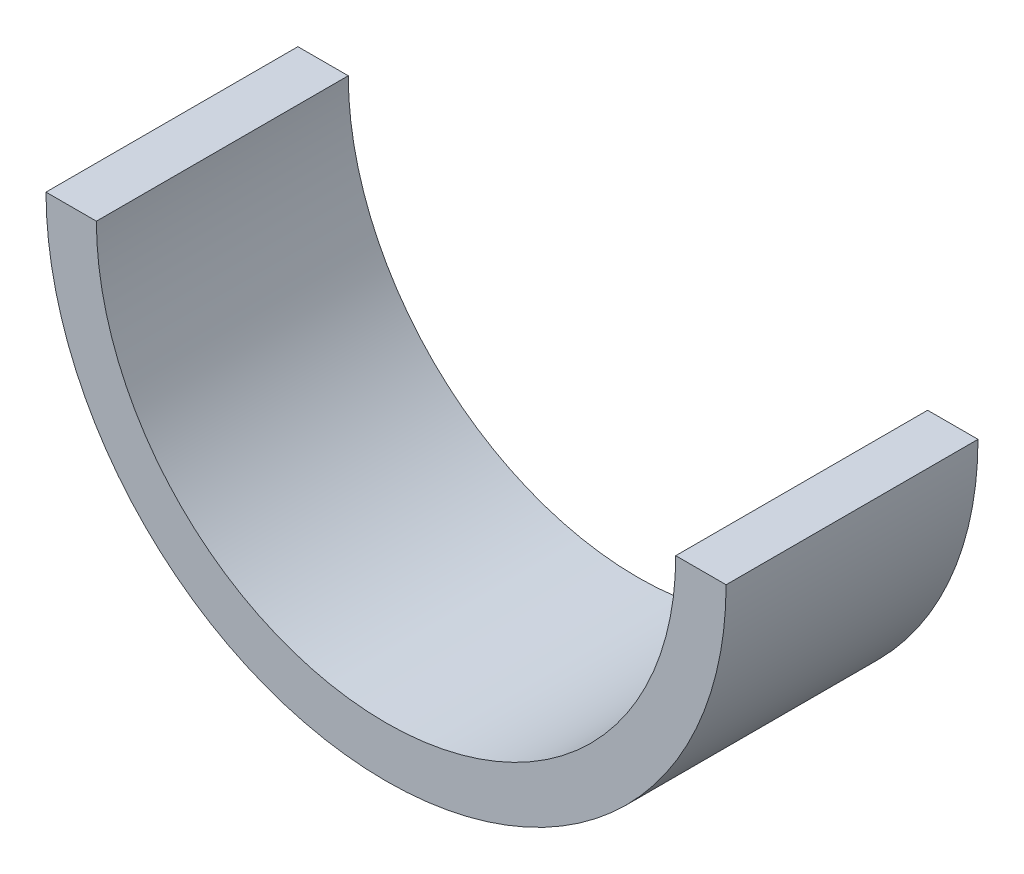
ISO-10303-21;
HEADER;
FILE_DESCRIPTION(('STEP AP214'),'2;1');
FILE_NAME('part.step','',(''),(''),'','','');
FILE_SCHEMA(('AUTOMOTIVE_DESIGN { 1 0 10303 214 1 1 1 1 }'));
ENDSEC;
DATA;
#1=APPLICATION_CONTEXT('core data for automotive mechanical design processes');
#2=APPLICATION_PROTOCOL_DEFINITION('international standard','automotive_design',2000,#1);
#3=PRODUCT_CONTEXT('',#1,'mechanical');
#4=PRODUCT('Part','Part','',(#3));
#5=PRODUCT_RELATED_PRODUCT_CATEGORY('part','',(#4));
#6=PRODUCT_DEFINITION_FORMATION('','',#4);
#7=PRODUCT_DEFINITION_CONTEXT('part definition',#1,'design');
#8=PRODUCT_DEFINITION('design','',#6,#7);
#9=PRODUCT_DEFINITION_SHAPE('','',#8);
#10=(LENGTH_UNIT() NAMED_UNIT(*) SI_UNIT(.MILLI.,.METRE.));
#11=(NAMED_UNIT(*) PLANE_ANGLE_UNIT() SI_UNIT($,.RADIAN.));
#12=(NAMED_UNIT(*) SI_UNIT($,.STERADIAN.) SOLID_ANGLE_UNIT());
#13=UNCERTAINTY_MEASURE_WITH_UNIT(LENGTH_MEASURE(1.E-05),#10,'distance_accuracy_value','');
#14=(GEOMETRIC_REPRESENTATION_CONTEXT(3) GLOBAL_UNCERTAINTY_ASSIGNED_CONTEXT((#13)) GLOBAL_UNIT_ASSIGNED_CONTEXT((#10,
#11,#12)) REPRESENTATION_CONTEXT('',''));
#15=CARTESIAN_POINT('',(0.,0.,0.));
#16=DIRECTION('',(0.,0.,1.));
#17=DIRECTION('',(1.,0.,0.));
#18=AXIS2_PLACEMENT_3D('',#15,#16,#17);
#19=CARTESIAN_POINT('',(27.,27.,20.));
#20=DIRECTION('',(0.,0.,-1.));
#21=DIRECTION('',(-1.,0.,0.));
#22=AXIS2_PLACEMENT_3D('',#19,#20,#21);
#23=CYLINDRICAL_SURFACE('',#22,27.);
#24=CARTESIAN_POINT('',(27.,27.,0.));
#25=DIRECTION('',(0.,0.,1.));
#26=DIRECTION('',(1.,0.,0.));
#27=AXIS2_PLACEMENT_3D('',#24,#25,#26);
#28=CIRCLE('',#27,27.);
#29=CARTESIAN_POINT('',(0.,27.,0.));
#30=VERTEX_POINT('',#29);
#31=CARTESIAN_POINT('',(54.,27.,0.));
#32=VERTEX_POINT('',#31);
#33=EDGE_CURVE('E108',#30,#32,#28,.T.);
#34=ORIENTED_EDGE('',*,*,#33,.T.);
#35=DIRECTION('',(0.,0.,-1.));
#36=VECTOR('',#35,1.);
#37=CARTESIAN_POINT('',(54.,27.,20.));
#38=LINE('',#37,#36);
#39=CARTESIAN_POINT('',(54.,27.,20.));
#40=VERTEX_POINT('',#39);
#41=EDGE_CURVE('E11',#40,#32,#38,.T.);
#42=ORIENTED_EDGE('',*,*,#41,.F.);
#43=CARTESIAN_POINT('',(27.,27.,20.));
#44=DIRECTION('',(0.,0.,1.));
#45=DIRECTION('',(1.,0.,0.));
#46=AXIS2_PLACEMENT_3D('',#43,#44,#45);
#47=CIRCLE('',#46,27.);
#48=CARTESIAN_POINT('',(0.,27.,20.));
#49=VERTEX_POINT('',#48);
#50=EDGE_CURVE('E92',#49,#40,#47,.T.);
#51=ORIENTED_EDGE('',*,*,#50,.F.);
#52=DIRECTION('',(0.,0.,-1.));
#53=VECTOR('',#52,1.);
#54=CARTESIAN_POINT('',(0.,27.,20.));
#55=LINE('',#54,#53);
#56=EDGE_CURVE('E105',#49,#30,#55,.T.);
#57=ORIENTED_EDGE('',*,*,#56,.T.);
#58=EDGE_LOOP('',(#34,#42,#51,#57));
#59=FACE_BOUND('',#58,.T.);
#60=ADVANCED_FACE('F43',(#59),#23,.T.);
#61=CARTESIAN_POINT('',(54.,27.,20.));
#62=DIRECTION('',(0.,-1.,0.));
#63=DIRECTION('',(0.,0.,-1.));
#64=AXIS2_PLACEMENT_3D('',#61,#62,#63);
#65=PLANE('',#64);
#66=DIRECTION('',(-1.,0.,0.));
#67=VECTOR('',#66,1.);
#68=CARTESIAN_POINT('',(54.,27.,0.));
#69=LINE('',#68,#67);
#70=CARTESIAN_POINT('',(50.,27.,0.));
#71=VERTEX_POINT('',#70);
#72=EDGE_CURVE('E97',#32,#71,#69,.T.);
#73=ORIENTED_EDGE('',*,*,#72,.T.);
#74=DIRECTION('',(0.,0.,-1.));
#75=VECTOR('',#74,1.);
#76=CARTESIAN_POINT('',(50.,27.,20.));
#77=LINE('',#76,#75);
#78=CARTESIAN_POINT('',(50.,27.,20.));
#79=VERTEX_POINT('',#78);
#80=EDGE_CURVE('E51',#79,#71,#77,.T.);
#81=ORIENTED_EDGE('',*,*,#80,.F.);
#82=DIRECTION('',(-1.,0.,0.));
#83=VECTOR('',#82,1.);
#84=CARTESIAN_POINT('',(54.,27.,20.));
#85=LINE('',#84,#83);
#86=EDGE_CURVE('E87',#40,#79,#85,.T.);
#87=ORIENTED_EDGE('',*,*,#86,.F.);
#88=ORIENTED_EDGE('',*,*,#41,.T.);
#89=EDGE_LOOP('',(#73,#81,#87,#88));
#90=FACE_BOUND('',#89,.T.);
#91=ADVANCED_FACE('F100',(#90),#65,.F.);
#92=CARTESIAN_POINT('',(27.,27.,20.));
#93=DIRECTION('',(0.,0.,-1.));
#94=DIRECTION('',(-1.,0.,0.));
#95=AXIS2_PLACEMENT_3D('',#92,#93,#94);
#96=CYLINDRICAL_SURFACE('',#95,23.);
#97=CARTESIAN_POINT('',(27.,27.,0.));
#98=DIRECTION('',(0.,0.,-1.));
#99=DIRECTION('',(-1.,0.,0.));
#100=AXIS2_PLACEMENT_3D('',#97,#98,#99);
#101=CIRCLE('',#100,23.);
#102=CARTESIAN_POINT('',(4.,27.,0.));
#103=VERTEX_POINT('',#102);
#104=EDGE_CURVE('E78',#71,#103,#101,.T.);
#105=ORIENTED_EDGE('',*,*,#104,.T.);
#106=DIRECTION('',(0.,0.,-1.));
#107=VECTOR('',#106,1.);
#108=CARTESIAN_POINT('',(4.,27.,20.));
#109=LINE('',#108,#107);
#110=CARTESIAN_POINT('',(4.,27.,20.));
#111=VERTEX_POINT('',#110);
#112=EDGE_CURVE('E98',#111,#103,#109,.T.);
#113=ORIENTED_EDGE('',*,*,#112,.F.);
#114=CARTESIAN_POINT('',(27.,27.,20.));
#115=DIRECTION('',(0.,0.,-1.));
#116=DIRECTION('',(-1.,0.,0.));
#117=AXIS2_PLACEMENT_3D('',#114,#115,#116);
#118=CIRCLE('',#117,23.);
#119=EDGE_CURVE('E95',#79,#111,#118,.T.);
#120=ORIENTED_EDGE('',*,*,#119,.F.);
#121=ORIENTED_EDGE('',*,*,#80,.T.);
#122=EDGE_LOOP('',(#105,#113,#120,#121));
#123=FACE_BOUND('',#122,.T.);
#124=ADVANCED_FACE('F99',(#123),#96,.F.);
#125=CARTESIAN_POINT('',(4.,27.,20.));
#126=DIRECTION('',(0.,-1.,0.));
#127=DIRECTION('',(0.,0.,-1.));
#128=AXIS2_PLACEMENT_3D('',#125,#126,#127);
#129=PLANE('',#128);
#130=DIRECTION('',(-1.,0.,0.));
#131=VECTOR('',#130,1.);
#132=CARTESIAN_POINT('',(4.,27.,0.));
#133=LINE('',#132,#131);
#134=EDGE_CURVE('E85',#103,#30,#133,.T.);
#135=ORIENTED_EDGE('',*,*,#134,.T.);
#136=ORIENTED_EDGE('',*,*,#56,.F.);
#137=DIRECTION('',(-1.,0.,0.));
#138=VECTOR('',#137,1.);
#139=CARTESIAN_POINT('',(4.,27.,20.));
#140=LINE('',#139,#138);
#141=EDGE_CURVE('E56',#111,#49,#140,.T.);
#142=ORIENTED_EDGE('',*,*,#141,.F.);
#143=ORIENTED_EDGE('',*,*,#112,.T.);
#144=EDGE_LOOP('',(#135,#136,#142,#143));
#145=FACE_BOUND('',#144,.T.);
#146=ADVANCED_FACE('F111',(#145),#129,.F.);
#147=CARTESIAN_POINT('',(27.,27.,20.));
#148=DIRECTION('',(0.,0.,1.));
#149=DIRECTION('',(1.,0.,0.));
#150=AXIS2_PLACEMENT_3D('',#147,#148,#149);
#151=PLANE('',#150);
#152=ORIENTED_EDGE('',*,*,#50,.T.);
#153=ORIENTED_EDGE('',*,*,#86,.T.);
#154=ORIENTED_EDGE('',*,*,#119,.T.);
#155=ORIENTED_EDGE('',*,*,#141,.T.);
#156=EDGE_LOOP('',(#152,#153,#154,#155));
#157=FACE_BOUND('',#156,.T.);
#158=ADVANCED_FACE('F89',(#157),#151,.T.);
#159=CARTESIAN_POINT('',(27.,27.,0.));
#160=DIRECTION('',(0.,0.,1.));
#161=DIRECTION('',(1.,0.,0.));
#162=AXIS2_PLACEMENT_3D('',#159,#160,#161);
#163=PLANE('',#162);
#164=ORIENTED_EDGE('',*,*,#33,.F.);
#165=ORIENTED_EDGE('',*,*,#134,.F.);
#166=ORIENTED_EDGE('',*,*,#104,.F.);
#167=ORIENTED_EDGE('',*,*,#72,.F.);
#168=EDGE_LOOP('',(#164,#165,#166,#167));
#169=FACE_BOUND('',#168,.T.);
#170=ADVANCED_FACE('F118',(#169),#163,.F.);
#171=CLOSED_SHELL('',(#60,#91,#124,#146,#158,#170));
#172=MANIFOLD_SOLID_BREP('B2',#171);
#173=ADVANCED_BREP_SHAPE_REPRESENTATION('',(#18,#172),#14);
#174=SHAPE_DEFINITION_REPRESENTATION(#9,#173);
ENDSEC;
END-ISO-10303-21;
